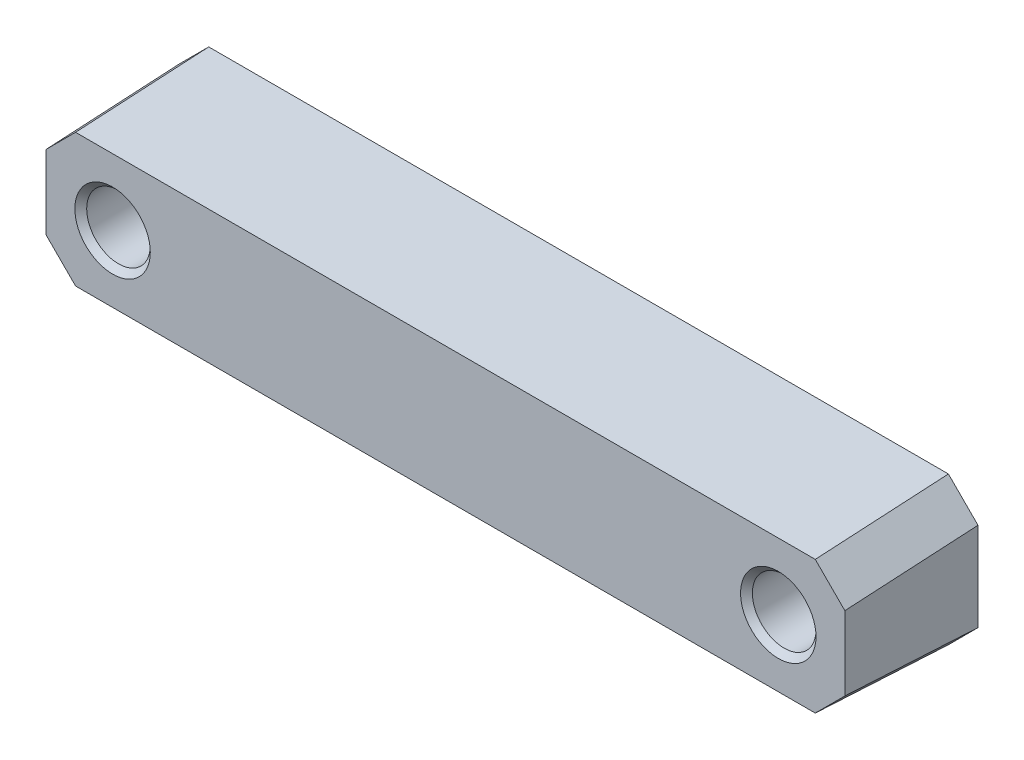
ISO-10303-21;
HEADER;
FILE_DESCRIPTION(('STEP AP214'),'2;1');
FILE_NAME('part.step','',(''),(''),'','','');
FILE_SCHEMA(('AUTOMOTIVE_DESIGN { 1 0 10303 214 1 1 1 1 }'));
ENDSEC;
DATA;
#1=APPLICATION_CONTEXT('core data for automotive mechanical design processes');
#2=APPLICATION_PROTOCOL_DEFINITION('international standard','automotive_design',2000,#1);
#3=PRODUCT_CONTEXT('',#1,'mechanical');
#4=PRODUCT('Part','Part','',(#3));
#5=PRODUCT_RELATED_PRODUCT_CATEGORY('part','',(#4));
#6=PRODUCT_DEFINITION_FORMATION('','',#4);
#7=PRODUCT_DEFINITION_CONTEXT('part definition',#1,'design');
#8=PRODUCT_DEFINITION('design','',#6,#7);
#9=PRODUCT_DEFINITION_SHAPE('','',#8);
#10=(LENGTH_UNIT() NAMED_UNIT(*) SI_UNIT(.MILLI.,.METRE.));
#11=(NAMED_UNIT(*) PLANE_ANGLE_UNIT() SI_UNIT($,.RADIAN.));
#12=(NAMED_UNIT(*) SI_UNIT($,.STERADIAN.) SOLID_ANGLE_UNIT());
#13=UNCERTAINTY_MEASURE_WITH_UNIT(LENGTH_MEASURE(1.E-05),#10,'distance_accuracy_value','');
#14=(GEOMETRIC_REPRESENTATION_CONTEXT(3) GLOBAL_UNCERTAINTY_ASSIGNED_CONTEXT((#13)) GLOBAL_UNIT_ASSIGNED_CONTEXT((#10,
#11,#12)) REPRESENTATION_CONTEXT('',''));
#15=CARTESIAN_POINT('',(0.,0.,0.));
#16=DIRECTION('',(0.,0.,1.));
#17=DIRECTION('',(1.,0.,0.));
#18=AXIS2_PLACEMENT_3D('',#15,#16,#17);
#19=CARTESIAN_POINT('',(0.,0.,9.));
#20=DIRECTION('',(0.,0.,1.));
#21=DIRECTION('',(1.,0.,0.));
#22=AXIS2_PLACEMENT_3D('',#19,#20,#21);
#23=PLANE('',#22);
#24=CARTESIAN_POINT('',(4.50000000000001,5.,9.));
#25=DIRECTION('',(0.,0.,1.));
#26=DIRECTION('',(1.,0.,0.));
#27=AXIS2_PLACEMENT_3D('',#24,#25,#26);
#28=CIRCLE('',#27,2.55);
#29=CARTESIAN_POINT('',(7.05000000000001,5.,9.));
#30=VERTEX_POINT('',#29);
#31=EDGE_CURVE('E388',#30,#30,#28,.F.);
#32=ORIENTED_EDGE('',*,*,#31,.T.);
#33=EDGE_LOOP('',(#32));
#34=FACE_BOUND('',#33,.T.);
#35=CARTESIAN_POINT('',(49.5,5.,9.));
#36=DIRECTION('',(0.,0.,1.));
#37=DIRECTION('',(1.,0.,0.));
#38=AXIS2_PLACEMENT_3D('',#35,#36,#37);
#39=CIRCLE('',#38,2.55);
#40=CARTESIAN_POINT('',(52.05,5.,9.));
#41=VERTEX_POINT('',#40);
#42=EDGE_CURVE('E403',#41,#41,#39,.F.);
#43=ORIENTED_EDGE('',*,*,#42,.T.);
#44=EDGE_LOOP('',(#43));
#45=FACE_BOUND('',#44,.T.);
#46=DIRECTION('',(1.,0.,0.));
#47=VECTOR('',#46,1.);
#48=CARTESIAN_POINT('',(0.,0.5,9.));
#49=LINE('',#48,#47);
#50=CARTESIAN_POINT('',(2.,0.5,9.));
#51=VERTEX_POINT('',#50);
#52=CARTESIAN_POINT('',(52.,0.5,9.));
#53=VERTEX_POINT('',#52);
#54=EDGE_CURVE('E327',#51,#53,#49,.T.);
#55=ORIENTED_EDGE('',*,*,#54,.T.);
#56=DIRECTION('',(-0.706561804780971,-0.707651337895052,0.));
#57=VECTOR('',#56,1.);
#58=CARTESIAN_POINT('',(25.7900619300527,-25.7503543438697,9.));
#59=LINE('',#58,#57);
#60=CARTESIAN_POINT('',(54.,2.50308404192446,9.));
#61=VERTEX_POINT('',#60);
#62=EDGE_CURVE('E340',#53,#61,#59,.F.);
#63=ORIENTED_EDGE('',*,*,#62,.T.);
#64=DIRECTION('',(0.,1.,0.));
#65=VECTOR('',#64,1.);
#66=CARTESIAN_POINT('',(54.,9.5,9.));
#67=LINE('',#66,#65);
#68=CARTESIAN_POINT('',(54.,7.49691595807556,9.));
#69=VERTEX_POINT('',#68);
#70=EDGE_CURVE('E119',#61,#69,#67,.T.);
#71=ORIENTED_EDGE('',*,*,#70,.T.);
#72=DIRECTION('',(0.706561804780975,-0.707651337895048,0.));
#73=VECTOR('',#72,1.);
#74=CARTESIAN_POINT('',(30.7900559946404,30.7426501836232,9.));
#75=LINE('',#74,#73);
#76=CARTESIAN_POINT('',(52.,9.5,9.));
#77=VERTEX_POINT('',#76);
#78=EDGE_CURVE('E114',#69,#77,#75,.F.);
#79=ORIENTED_EDGE('',*,*,#78,.T.);
#80=DIRECTION('',(-1.,0.,0.));
#81=VECTOR('',#80,1.);
#82=CARTESIAN_POINT('',(0.,9.5,9.));
#83=LINE('',#82,#81);
#84=CARTESIAN_POINT('',(2.00000000000001,9.5,9.));
#85=VERTEX_POINT('',#84);
#86=EDGE_CURVE('E117',#77,#85,#83,.T.);
#87=ORIENTED_EDGE('',*,*,#86,.T.);
#88=DIRECTION('',(0.706561804780972,0.707651337895051,0.));
#89=VECTOR('',#88,1.);
#90=CARTESIAN_POINT('',(-3.74845352930925,3.74268223484817,9.));
#91=LINE('',#90,#89);
#92=CARTESIAN_POINT('',(0.,7.49691595807554,9.));
#93=VERTEX_POINT('',#92);
#94=EDGE_CURVE('E125',#85,#93,#91,.F.);
#95=ORIENTED_EDGE('',*,*,#94,.T.);
#96=DIRECTION('',(0.,-1.,0.));
#97=VECTOR('',#96,1.);
#98=CARTESIAN_POINT('',(0.,9.5,9.));
#99=LINE('',#98,#97);
#100=CARTESIAN_POINT('',(0.,2.50308404192444,9.));
#101=VERTEX_POINT('',#100);
#102=EDGE_CURVE('E161',#93,#101,#99,.T.);
#103=ORIENTED_EDGE('',*,*,#102,.T.);
#104=DIRECTION('',(-0.706561804780974,0.707651337895049,0.));
#105=VECTOR('',#104,1.);
#106=CARTESIAN_POINT('',(1.25154053527871,1.24961360490527,9.));
#107=LINE('',#106,#105);
#108=EDGE_CURVE('E212',#101,#51,#107,.F.);
#109=ORIENTED_EDGE('',*,*,#108,.T.);
#110=EDGE_LOOP('',(#55,#63,#71,#79,#87,#95,#103,#109));
#111=FACE_BOUND('',#110,.T.);
#112=ADVANCED_FACE('F43',(#34,#45,#111),#23,.T.);
#113=CARTESIAN_POINT('',(0.,0.,0.));
#114=DIRECTION('',(0.,0.,-1.));
#115=DIRECTION('',(-1.,0.,0.));
#116=AXIS2_PLACEMENT_3D('',#113,#114,#115);
#117=PLANE('',#116);
#118=CARTESIAN_POINT('',(4.50000000000001,5.,0.));
#119=DIRECTION('',(0.,0.,-1.));
#120=DIRECTION('',(-1.,0.,0.));
#121=AXIS2_PLACEMENT_3D('',#118,#119,#120);
#122=CIRCLE('',#121,2.55000000000001);
#123=CARTESIAN_POINT('',(1.95,5.,0.));
#124=VERTEX_POINT('',#123);
#125=EDGE_CURVE('E398',#124,#124,#122,.F.);
#126=ORIENTED_EDGE('',*,*,#125,.T.);
#127=EDGE_LOOP('',(#126));
#128=FACE_BOUND('',#127,.T.);
#129=CARTESIAN_POINT('',(49.5,5.,0.));
#130=DIRECTION('',(0.,0.,-1.));
#131=DIRECTION('',(-1.,0.,0.));
#132=AXIS2_PLACEMENT_3D('',#129,#130,#131);
#133=CIRCLE('',#132,2.55);
#134=CARTESIAN_POINT('',(46.95,5.,0.));
#135=VERTEX_POINT('',#134);
#136=EDGE_CURVE('E394',#135,#135,#133,.F.);
#137=ORIENTED_EDGE('',*,*,#136,.T.);
#138=EDGE_LOOP('',(#137));
#139=FACE_BOUND('',#138,.T.);
#140=DIRECTION('',(0.,1.,0.));
#141=VECTOR('',#140,1.);
#142=CARTESIAN_POINT('',(54.,0.,0.));
#143=LINE('',#142,#141);
#144=CARTESIAN_POINT('',(54.,2.00308404192446,0.));
#145=VERTEX_POINT('',#144);
#146=CARTESIAN_POINT('',(54.,7.99691595807556,0.));
#147=VERTEX_POINT('',#146);
#148=EDGE_CURVE('E255',#145,#147,#143,.T.);
#149=ORIENTED_EDGE('',*,*,#148,.F.);
#150=DIRECTION('',(0.706561804780971,0.707651337895052,0.));
#151=VECTOR('',#150,1.);
#152=CARTESIAN_POINT('',(26.0400616332821,-25.9999691358574,0.));
#153=LINE('',#152,#151);
#154=CARTESIAN_POINT('',(52.,0.,0.));
#155=VERTEX_POINT('',#154);
#156=EDGE_CURVE('E53',#145,#155,#153,.F.);
#157=ORIENTED_EDGE('',*,*,#156,.T.);
#158=DIRECTION('',(1.,0.,0.));
#159=VECTOR('',#158,1.);
#160=CARTESIAN_POINT('',(0.,0.,0.));
#161=LINE('',#160,#159);
#162=CARTESIAN_POINT('',(2.,0.,0.));
#163=VERTEX_POINT('',#162);
#164=EDGE_CURVE('E334',#163,#155,#161,.T.);
#165=ORIENTED_EDGE('',*,*,#164,.F.);
#166=DIRECTION('',(0.706561804780974,-0.707651337895049,0.));
#167=VECTOR('',#166,1.);
#168=CARTESIAN_POINT('',(1.00154083204931,0.999998812917594,0.));
#169=LINE('',#168,#167);
#170=CARTESIAN_POINT('',(0.,2.00308404192444,0.));
#171=VERTEX_POINT('',#170);
#172=EDGE_CURVE('E61',#163,#171,#169,.F.);
#173=ORIENTED_EDGE('',*,*,#172,.T.);
#174=DIRECTION('',(0.,-1.,0.));
#175=VECTOR('',#174,1.);
#176=CARTESIAN_POINT('',(0.,0.,0.));
#177=LINE('',#176,#175);
#178=CARTESIAN_POINT('',(0.,7.99691595807554,0.));
#179=VERTEX_POINT('',#178);
#180=EDGE_CURVE('E47',#179,#171,#177,.T.);
#181=ORIENTED_EDGE('',*,*,#180,.F.);
#182=DIRECTION('',(-0.706561804780972,-0.707651337895051,0.));
#183=VECTOR('',#182,1.);
#184=CARTESIAN_POINT('',(-3.99845323253865,3.99229702683584,0.));
#185=LINE('',#184,#183);
#186=CARTESIAN_POINT('',(2.00000000000001,10.,0.));
#187=VERTEX_POINT('',#186);
#188=EDGE_CURVE('E311',#179,#187,#185,.F.);
#189=ORIENTED_EDGE('',*,*,#188,.T.);
#190=DIRECTION('',(-1.,0.,0.));
#191=VECTOR('',#190,1.);
#192=CARTESIAN_POINT('',(0.,10.,0.));
#193=LINE('',#192,#191);
#194=CARTESIAN_POINT('',(52.,10.,0.));
#195=VERTEX_POINT('',#194);
#196=EDGE_CURVE('E322',#195,#187,#193,.T.);
#197=ORIENTED_EDGE('',*,*,#196,.F.);
#198=DIRECTION('',(-0.706561804780975,0.707651337895048,0.));
#199=VECTOR('',#198,1.);
#200=CARTESIAN_POINT('',(31.0400556978698,30.9922649756109,0.));
#201=LINE('',#200,#199);
#202=EDGE_CURVE('E143',#195,#147,#201,.F.);
#203=ORIENTED_EDGE('',*,*,#202,.T.);
#204=EDGE_LOOP('',(#149,#157,#165,#173,#181,#189,#197,#203));
#205=FACE_BOUND('',#204,.T.);
#206=ADVANCED_FACE('F181',(#128,#139,#205),#117,.T.);
#207=CARTESIAN_POINT('',(0.,9.96923076923077,0.553846153846154));
#208=DIRECTION('',(0.,-0.998460353205412,-0.055470019622523));
#209=DIRECTION('',(0.,0.055470019622523,-0.998460353205412));
#210=AXIS2_PLACEMENT_3D('',#207,#208,#209);
#211=PLANE('',#210);
#212=ORIENTED_EDGE('',*,*,#196,.T.);
#213=DIRECTION('',(0.,-0.055470019622523,0.998460353205412));
#214=VECTOR('',#213,1.);
#215=CARTESIAN_POINT('',(2.00000000000001,9.96923076923077,0.553846153846154));
#216=LINE('',#215,#214);
#217=EDGE_CURVE('E126',#187,#85,#216,.T.);
#218=ORIENTED_EDGE('',*,*,#217,.T.);
#219=ORIENTED_EDGE('',*,*,#86,.F.);
#220=DIRECTION('',(0.,0.055470019622523,-0.998460353205412));
#221=VECTOR('',#220,1.);
#222=CARTESIAN_POINT('',(52.,9.96923076923077,0.553846153846155));
#223=LINE('',#222,#221);
#224=EDGE_CURVE('E133',#77,#195,#223,.T.);
#225=ORIENTED_EDGE('',*,*,#224,.T.);
#226=EDGE_LOOP('',(#212,#218,#219,#225));
#227=FACE_BOUND('',#226,.T.);
#228=ADVANCED_FACE('F132',(#227),#211,.F.);
#229=CARTESIAN_POINT('',(54.,0.,0.));
#230=DIRECTION('',(-1.,0.,0.));
#231=DIRECTION('',(0.,0.,1.));
#232=AXIS2_PLACEMENT_3D('',#229,#230,#231);
#233=PLANE('',#232);
#234=ORIENTED_EDGE('',*,*,#70,.F.);
#235=DIRECTION('',(0.,-0.055470019622523,-0.998460353205412));
#236=VECTOR('',#235,1.);
#237=CARTESIAN_POINT('',(54.,1.99692070641085,-0.110940039245047));
#238=LINE('',#237,#236);
#239=EDGE_CURVE('E69',#61,#145,#238,.T.);
#240=ORIENTED_EDGE('',*,*,#239,.T.);
#241=ORIENTED_EDGE('',*,*,#148,.T.);
#242=DIRECTION('',(0.,-0.055470019622523,0.998460353205412));
#243=VECTOR('',#242,1.);
#244=CARTESIAN_POINT('',(54.,7.97231006281994,0.442906114601108));
#245=LINE('',#244,#243);
#246=EDGE_CURVE('E315',#147,#69,#245,.T.);
#247=ORIENTED_EDGE('',*,*,#246,.T.);
#248=EDGE_LOOP('',(#234,#240,#241,#247));
#249=FACE_BOUND('',#248,.T.);
#250=ADVANCED_FACE('F223',(#249),#233,.F.);
#251=CARTESIAN_POINT('',(0.,0.,0.));
#252=DIRECTION('',(1.,0.,0.));
#253=DIRECTION('',(0.,0.,-1.));
#254=AXIS2_PLACEMENT_3D('',#251,#252,#253);
#255=PLANE('',#254);
#256=ORIENTED_EDGE('',*,*,#180,.T.);
#257=DIRECTION('',(0.,0.055470019622523,0.998460353205412));
#258=VECTOR('',#257,1.);
#259=CARTESIAN_POINT('',(0.,1.99692070641083,-0.110940039245046));
#260=LINE('',#259,#258);
#261=EDGE_CURVE('E12',#171,#101,#260,.T.);
#262=ORIENTED_EDGE('',*,*,#261,.T.);
#263=ORIENTED_EDGE('',*,*,#102,.F.);
#264=DIRECTION('',(0.,0.055470019622523,-0.998460353205412));
#265=VECTOR('',#264,1.);
#266=CARTESIAN_POINT('',(0.,7.97231006281993,0.442906114601107));
#267=LINE('',#266,#265);
#268=EDGE_CURVE('E306',#93,#179,#267,.T.);
#269=ORIENTED_EDGE('',*,*,#268,.T.);
#270=EDGE_LOOP('',(#256,#262,#263,#269));
#271=FACE_BOUND('',#270,.T.);
#272=ADVANCED_FACE('F232',(#271),#255,.F.);
#273=CARTESIAN_POINT('',(0.,0.,0.));
#274=DIRECTION('',(0.,0.998460353205412,-0.055470019622523));
#275=DIRECTION('',(0.,0.055470019622523,0.998460353205412));
#276=AXIS2_PLACEMENT_3D('',#273,#274,#275);
#277=PLANE('',#276);
#278=ORIENTED_EDGE('',*,*,#164,.T.);
#279=DIRECTION('',(0.,0.055470019622523,0.998460353205412));
#280=VECTOR('',#279,1.);
#281=CARTESIAN_POINT('',(52.,0.,0.));
#282=LINE('',#281,#280);
#283=EDGE_CURVE('E338',#155,#53,#282,.T.);
#284=ORIENTED_EDGE('',*,*,#283,.T.);
#285=ORIENTED_EDGE('',*,*,#54,.F.);
#286=DIRECTION('',(0.,-0.055470019622523,-0.998460353205412));
#287=VECTOR('',#286,1.);
#288=CARTESIAN_POINT('',(2.,0.,0.));
#289=LINE('',#288,#287);
#290=EDGE_CURVE('E319',#51,#163,#289,.T.);
#291=ORIENTED_EDGE('',*,*,#290,.T.);
#292=EDGE_LOOP('',(#278,#284,#285,#291));
#293=FACE_BOUND('',#292,.T.);
#294=ADVANCED_FACE('F183',(#293),#277,.F.);
#295=CARTESIAN_POINT('',(4.50000000000001,5.,10.));
#296=DIRECTION('',(0.,0.,-1.));
#297=DIRECTION('',(-1.,0.,0.));
#298=AXIS2_PLACEMENT_3D('',#295,#296,#297);
#299=CYLINDRICAL_SURFACE('',#298,2.15);
#300=CARTESIAN_POINT('',(4.50000000000001,5.,0.400000000000011));
#301=DIRECTION('',(0.,0.,-1.));
#302=DIRECTION('',(-1.,0.,0.));
#303=AXIS2_PLACEMENT_3D('',#300,#301,#302);
#304=CIRCLE('',#303,2.15);
#305=CARTESIAN_POINT('',(2.35000000000001,5.,0.400000000000011));
#306=VERTEX_POINT('',#305);
#307=EDGE_CURVE('E392',#306,#306,#304,.T.);
#308=ORIENTED_EDGE('',*,*,#307,.T.);
#309=EDGE_LOOP('',(#308));
#310=FACE_BOUND('',#309,.T.);
#311=CARTESIAN_POINT('',(4.50000000000001,5.,8.6));
#312=DIRECTION('',(0.,0.,1.));
#313=DIRECTION('',(1.,0.,0.));
#314=AXIS2_PLACEMENT_3D('',#311,#312,#313);
#315=CIRCLE('',#314,2.15);
#316=CARTESIAN_POINT('',(6.65000000000001,5.,8.6));
#317=VERTEX_POINT('',#316);
#318=EDGE_CURVE('E136',#317,#317,#315,.T.);
#319=ORIENTED_EDGE('',*,*,#318,.T.);
#320=EDGE_LOOP('',(#319));
#321=FACE_BOUND('',#320,.T.);
#322=ADVANCED_FACE('F277',(#310,#321),#299,.F.);
#323=CARTESIAN_POINT('',(49.5,5.,10.));
#324=DIRECTION('',(0.,0.,-1.));
#325=DIRECTION('',(-1.,0.,0.));
#326=AXIS2_PLACEMENT_3D('',#323,#324,#325);
#327=CYLINDRICAL_SURFACE('',#326,2.15);
#328=CARTESIAN_POINT('',(49.5,5.,0.400000000000003));
#329=DIRECTION('',(0.,0.,-1.));
#330=DIRECTION('',(-1.,0.,0.));
#331=AXIS2_PLACEMENT_3D('',#328,#329,#330);
#332=CIRCLE('',#331,2.15);
#333=CARTESIAN_POINT('',(47.35,5.,0.400000000000003));
#334=VERTEX_POINT('',#333);
#335=EDGE_CURVE('E144',#334,#334,#332,.T.);
#336=ORIENTED_EDGE('',*,*,#335,.T.);
#337=EDGE_LOOP('',(#336));
#338=FACE_BOUND('',#337,.T.);
#339=CARTESIAN_POINT('',(49.5,5.,8.6));
#340=DIRECTION('',(0.,0.,1.));
#341=DIRECTION('',(1.,0.,0.));
#342=AXIS2_PLACEMENT_3D('',#339,#340,#341);
#343=CIRCLE('',#342,2.15);
#344=CARTESIAN_POINT('',(51.65,5.,8.6));
#345=VERTEX_POINT('',#344);
#346=EDGE_CURVE('E148',#345,#345,#343,.T.);
#347=ORIENTED_EDGE('',*,*,#346,.T.);
#348=EDGE_LOOP('',(#347));
#349=FACE_BOUND('',#348,.T.);
#350=ADVANCED_FACE('F383',(#338,#349),#327,.F.);
#351=CARTESIAN_POINT('',(4.50000000000001,5.,0.400000000000011));
#352=DIRECTION('',(0.,0.,-1.));
#353=DIRECTION('',(-1.,0.,0.));
#354=AXIS2_PLACEMENT_3D('',#351,#352,#353);
#355=CONICAL_SURFACE('',#354,2.15,0.785398163397447);
#356=ORIENTED_EDGE('',*,*,#125,.F.);
#357=EDGE_LOOP('',(#356));
#358=FACE_BOUND('',#357,.T.);
#359=ORIENTED_EDGE('',*,*,#307,.F.);
#360=EDGE_LOOP('',(#359));
#361=FACE_BOUND('',#360,.T.);
#362=ADVANCED_FACE('F186',(#358,#361),#355,.F.);
#363=CARTESIAN_POINT('',(4.50000000000001,5.,8.6));
#364=DIRECTION('',(0.,0.,1.));
#365=DIRECTION('',(1.,0.,0.));
#366=AXIS2_PLACEMENT_3D('',#363,#364,#365);
#367=CONICAL_SURFACE('',#366,2.15,0.785398163397452);
#368=ORIENTED_EDGE('',*,*,#31,.F.);
#369=EDGE_LOOP('',(#368));
#370=FACE_BOUND('',#369,.T.);
#371=ORIENTED_EDGE('',*,*,#318,.F.);
#372=EDGE_LOOP('',(#371));
#373=FACE_BOUND('',#372,.T.);
#374=ADVANCED_FACE('F376',(#370,#373),#367,.F.);
#375=CARTESIAN_POINT('',(49.5,5.,0.400000000000003));
#376=DIRECTION('',(0.,0.,-1.));
#377=DIRECTION('',(-1.,0.,0.));
#378=AXIS2_PLACEMENT_3D('',#375,#376,#377);
#379=CONICAL_SURFACE('',#378,2.15,0.785398163397448);
#380=ORIENTED_EDGE('',*,*,#136,.F.);
#381=EDGE_LOOP('',(#380));
#382=FACE_BOUND('',#381,.T.);
#383=ORIENTED_EDGE('',*,*,#335,.F.);
#384=EDGE_LOOP('',(#383));
#385=FACE_BOUND('',#384,.T.);
#386=ADVANCED_FACE('F373',(#382,#385),#379,.F.);
#387=CARTESIAN_POINT('',(49.5,5.,8.6));
#388=DIRECTION('',(0.,0.,1.));
#389=DIRECTION('',(1.,0.,0.));
#390=AXIS2_PLACEMENT_3D('',#387,#388,#389);
#391=CONICAL_SURFACE('',#390,2.15,0.78539816339745);
#392=ORIENTED_EDGE('',*,*,#42,.F.);
#393=EDGE_LOOP('',(#392));
#394=FACE_BOUND('',#393,.T.);
#395=ORIENTED_EDGE('',*,*,#346,.F.);
#396=EDGE_LOOP('',(#395));
#397=FACE_BOUND('',#396,.T.);
#398=ADVANCED_FACE('F369',(#394,#397),#391,.F.);
#399=CARTESIAN_POINT('',(2.00000000000001,9.96923076923077,0.553846153846154));
#400=DIRECTION('',(0.707106781186549,-0.706018086497461,-0.0392232270276369));
#401=DIRECTION('',(0.,-0.055470019622523,0.998460353205412));
#402=AXIS2_PLACEMENT_3D('',#399,#400,#401);
#403=PLANE('',#402);
#404=ORIENTED_EDGE('',*,*,#188,.F.);
#405=ORIENTED_EDGE('',*,*,#268,.F.);
#406=ORIENTED_EDGE('',*,*,#94,.F.);
#407=ORIENTED_EDGE('',*,*,#217,.F.);
#408=EDGE_LOOP('',(#404,#405,#406,#407));
#409=FACE_BOUND('',#408,.T.);
#410=ADVANCED_FACE('F364',(#409),#403,.F.);
#411=CARTESIAN_POINT('',(54.,7.97231006281994,0.442906114601108));
#412=DIRECTION('',(-0.707106781186546,-0.706018086497464,-0.0392232270276369));
#413=DIRECTION('',(0.,-0.055470019622523,0.998460353205412));
#414=AXIS2_PLACEMENT_3D('',#411,#412,#413);
#415=PLANE('',#414);
#416=ORIENTED_EDGE('',*,*,#202,.F.);
#417=ORIENTED_EDGE('',*,*,#224,.F.);
#418=ORIENTED_EDGE('',*,*,#78,.F.);
#419=ORIENTED_EDGE('',*,*,#246,.F.);
#420=EDGE_LOOP('',(#416,#417,#418,#419));
#421=FACE_BOUND('',#420,.T.);
#422=ADVANCED_FACE('F141',(#421),#415,.F.);
#423=CARTESIAN_POINT('',(52.,0.,0.));
#424=DIRECTION('',(-0.70710678118655,0.70601808649746,-0.0392232270276367));
#425=DIRECTION('',(0.,0.055470019622523,0.998460353205412));
#426=AXIS2_PLACEMENT_3D('',#423,#424,#425);
#427=PLANE('',#426);
#428=ORIENTED_EDGE('',*,*,#156,.F.);
#429=ORIENTED_EDGE('',*,*,#239,.F.);
#430=ORIENTED_EDGE('',*,*,#62,.F.);
#431=ORIENTED_EDGE('',*,*,#283,.F.);
#432=EDGE_LOOP('',(#428,#429,#430,#431));
#433=FACE_BOUND('',#432,.T.);
#434=ADVANCED_FACE('F357',(#433),#427,.F.);
#435=CARTESIAN_POINT('',(0.,1.99692070641083,-0.110940039245046));
#436=DIRECTION('',(0.707106781186547,0.706018086497463,-0.0392232270276369));
#437=DIRECTION('',(0.,0.055470019622523,0.998460353205412));
#438=AXIS2_PLACEMENT_3D('',#435,#436,#437);
#439=PLANE('',#438);
#440=ORIENTED_EDGE('',*,*,#172,.F.);
#441=ORIENTED_EDGE('',*,*,#290,.F.);
#442=ORIENTED_EDGE('',*,*,#108,.F.);
#443=ORIENTED_EDGE('',*,*,#261,.F.);
#444=EDGE_LOOP('',(#440,#441,#442,#443));
#445=FACE_BOUND('',#444,.T.);
#446=ADVANCED_FACE('F45',(#445),#439,.F.);
#447=CLOSED_SHELL('',(#112,#206,#228,#250,#272,#294,#322,#350,#362,#374,#386,#398,#410,#422,
#434,#446));
#448=MANIFOLD_SOLID_BREP('B2',#447);
#449=ADVANCED_BREP_SHAPE_REPRESENTATION('',(#18,#448),#14);
#450=SHAPE_DEFINITION_REPRESENTATION(#9,#449);
ENDSEC;
END-ISO-10303-21;
